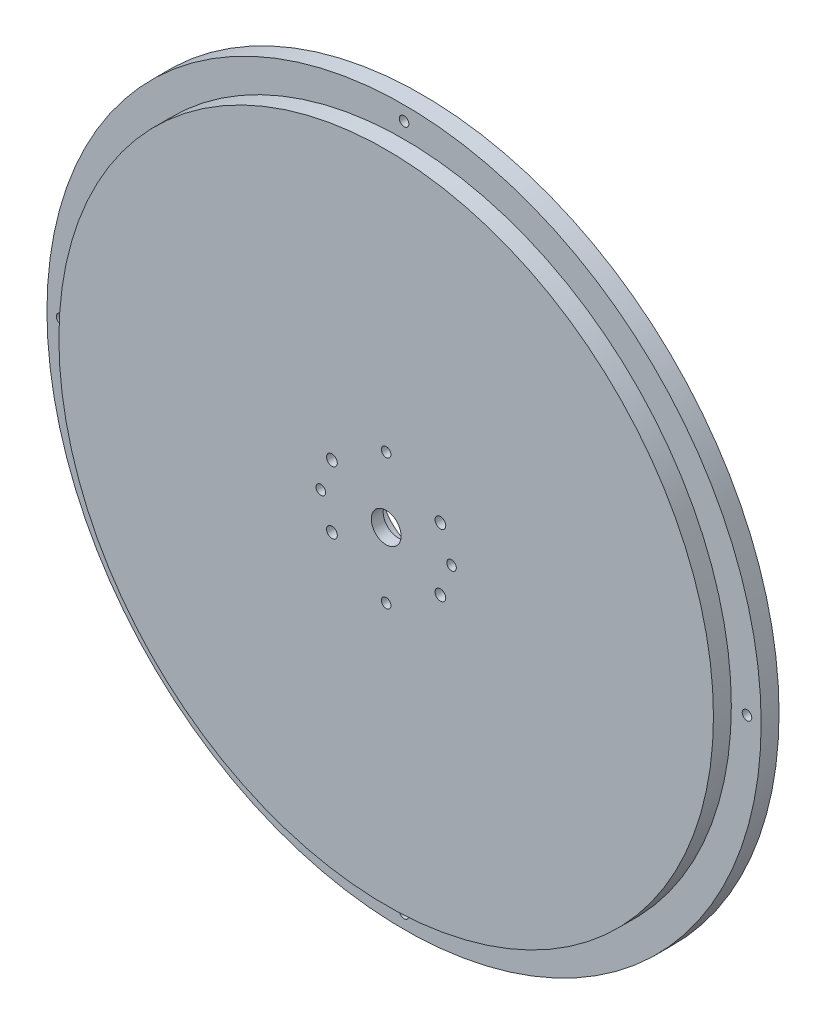
ISO-10303-21;
HEADER;
FILE_DESCRIPTION(('STEP AP214'),'2;1');
FILE_NAME('part.step','',(''),(''),'','','');
FILE_SCHEMA(('AUTOMOTIVE_DESIGN { 1 0 10303 214 1 1 1 1 }'));
ENDSEC;
DATA;
#1=APPLICATION_CONTEXT('core data for automotive mechanical design processes');
#2=APPLICATION_PROTOCOL_DEFINITION('international standard','automotive_design',2000,#1);
#3=PRODUCT_CONTEXT('',#1,'mechanical');
#4=PRODUCT('Part','Part','',(#3));
#5=PRODUCT_RELATED_PRODUCT_CATEGORY('part','',(#4));
#6=PRODUCT_DEFINITION_FORMATION('','',#4);
#7=PRODUCT_DEFINITION_CONTEXT('part definition',#1,'design');
#8=PRODUCT_DEFINITION('design','',#6,#7);
#9=PRODUCT_DEFINITION_SHAPE('','',#8);
#10=(LENGTH_UNIT() NAMED_UNIT(*) SI_UNIT(.MILLI.,.METRE.));
#11=(NAMED_UNIT(*) PLANE_ANGLE_UNIT() SI_UNIT($,.RADIAN.));
#12=(NAMED_UNIT(*) SI_UNIT($,.STERADIAN.) SOLID_ANGLE_UNIT());
#13=UNCERTAINTY_MEASURE_WITH_UNIT(LENGTH_MEASURE(1.E-05),#10,'distance_accuracy_value','');
#14=(GEOMETRIC_REPRESENTATION_CONTEXT(3) GLOBAL_UNCERTAINTY_ASSIGNED_CONTEXT((#13)) GLOBAL_UNIT_ASSIGNED_CONTEXT((#10,
#11,#12)) REPRESENTATION_CONTEXT('',''));
#15=CARTESIAN_POINT('',(0.,0.,0.));
#16=DIRECTION('',(0.,0.,1.));
#17=DIRECTION('',(1.,0.,0.));
#18=AXIS2_PLACEMENT_3D('',#15,#16,#17);
#19=CARTESIAN_POINT('',(0.,0.,20.));
#20=DIRECTION('',(0.,0.,-1.));
#21=DIRECTION('',(-1.,0.,0.));
#22=AXIS2_PLACEMENT_3D('',#19,#20,#21);
#23=CYLINDRICAL_SURFACE('',#22,5.);
#24=CARTESIAN_POINT('',(0.,0.,12.));
#25=DIRECTION('',(0.,0.,1.));
#26=DIRECTION('',(1.,0.,0.));
#27=AXIS2_PLACEMENT_3D('',#24,#25,#26);
#28=CIRCLE('',#27,5.);
#29=CARTESIAN_POINT('',(5.,0.,12.));
#30=VERTEX_POINT('',#29);
#31=EDGE_CURVE('E97',#30,#30,#28,.T.);
#32=ORIENTED_EDGE('',*,*,#31,.T.);
#33=EDGE_LOOP('',(#32));
#34=FACE_BOUND('',#33,.T.);
#35=CARTESIAN_POINT('',(0.,0.,8.));
#36=DIRECTION('',(0.,0.,-1.));
#37=DIRECTION('',(-1.,0.,0.));
#38=AXIS2_PLACEMENT_3D('',#35,#36,#37);
#39=CIRCLE('',#38,5.);
#40=CARTESIAN_POINT('',(-5.,0.,8.));
#41=VERTEX_POINT('',#40);
#42=EDGE_CURVE('E37',#41,#41,#39,.F.);
#43=ORIENTED_EDGE('',*,*,#42,.F.);
#44=EDGE_LOOP('',(#43));
#45=FACE_BOUND('',#44,.T.);
#46=ADVANCED_FACE('F33',(#34,#45),#23,.F.);
#47=CARTESIAN_POINT('',(0.,0.,12.));
#48=DIRECTION('',(0.,0.,-1.));
#49=DIRECTION('',(-1.,0.,0.));
#50=AXIS2_PLACEMENT_3D('',#47,#48,#49);
#51=CYLINDRICAL_SURFACE('',#50,109.75);
#52=CARTESIAN_POINT('',(0.,0.,6.));
#53=DIRECTION('',(0.,0.,1.));
#54=DIRECTION('',(1.,0.,0.));
#55=AXIS2_PLACEMENT_3D('',#52,#53,#54);
#56=CIRCLE('',#55,109.75);
#57=CARTESIAN_POINT('',(109.75,0.,6.));
#58=VERTEX_POINT('',#57);
#59=EDGE_CURVE('E41',#58,#58,#56,.T.);
#60=ORIENTED_EDGE('',*,*,#59,.T.);
#61=EDGE_LOOP('',(#60));
#62=FACE_BOUND('',#61,.T.);
#63=CARTESIAN_POINT('',(0.,0.,12.));
#64=DIRECTION('',(0.,0.,1.));
#65=DIRECTION('',(1.,0.,0.));
#66=AXIS2_PLACEMENT_3D('',#63,#64,#65);
#67=CIRCLE('',#66,109.75);
#68=CARTESIAN_POINT('',(109.75,0.,12.));
#69=VERTEX_POINT('',#68);
#70=EDGE_CURVE('E10',#69,#69,#67,.T.);
#71=ORIENTED_EDGE('',*,*,#70,.F.);
#72=EDGE_LOOP('',(#71));
#73=FACE_BOUND('',#72,.T.);
#74=ADVANCED_FACE('F35',(#62,#73),#51,.T.);
#75=CARTESIAN_POINT('',(0.,0.,12.));
#76=DIRECTION('',(0.,0.,1.));
#77=DIRECTION('',(1.,0.,0.));
#78=AXIS2_PLACEMENT_3D('',#75,#76,#77);
#79=PLANE('',#78);
#80=CARTESIAN_POINT('',(18.1865334794733,-10.4999999999998,12.));
#81=DIRECTION('',(0.,0.,1.));
#82=DIRECTION('',(1.,0.,0.));
#83=AXIS2_PLACEMENT_3D('',#80,#81,#82);
#84=CIRCLE('',#83,1.8);
#85=CARTESIAN_POINT('',(19.9865334794733,-10.4999999999998,12.));
#86=VERTEX_POINT('',#85);
#87=EDGE_CURVE('E104',#86,#86,#84,.T.);
#88=ORIENTED_EDGE('',*,*,#87,.F.);
#89=EDGE_LOOP('',(#88));
#90=FACE_BOUND('',#89,.T.);
#91=CARTESIAN_POINT('',(-18.1865334794732,-10.5000000000001,12.));
#92=DIRECTION('',(0.,0.,1.));
#93=DIRECTION('',(1.,0.,0.));
#94=AXIS2_PLACEMENT_3D('',#91,#92,#93);
#95=CIRCLE('',#94,1.8);
#96=CARTESIAN_POINT('',(-16.3865334794732,-10.5000000000001,12.));
#97=VERTEX_POINT('',#96);
#98=EDGE_CURVE('E107',#97,#97,#95,.T.);
#99=ORIENTED_EDGE('',*,*,#98,.F.);
#100=EDGE_LOOP('',(#99));
#101=FACE_BOUND('',#100,.T.);
#102=CARTESIAN_POINT('',(-18.1865334794732,10.5,12.));
#103=DIRECTION('',(0.,0.,1.));
#104=DIRECTION('',(1.,0.,0.));
#105=AXIS2_PLACEMENT_3D('',#102,#103,#104);
#106=CIRCLE('',#105,1.8);
#107=CARTESIAN_POINT('',(-16.3865334794732,10.5,12.));
#108=VERTEX_POINT('',#107);
#109=EDGE_CURVE('E110',#108,#108,#106,.T.);
#110=ORIENTED_EDGE('',*,*,#109,.F.);
#111=EDGE_LOOP('',(#110));
#112=FACE_BOUND('',#111,.T.);
#113=CARTESIAN_POINT('',(18.1865334794732,10.5,12.));
#114=DIRECTION('',(0.,0.,1.));
#115=DIRECTION('',(1.,0.,0.));
#116=AXIS2_PLACEMENT_3D('',#113,#114,#115);
#117=CIRCLE('',#116,1.8);
#118=CARTESIAN_POINT('',(19.9865334794732,10.5,12.));
#119=VERTEX_POINT('',#118);
#120=EDGE_CURVE('E113',#119,#119,#117,.T.);
#121=ORIENTED_EDGE('',*,*,#120,.F.);
#122=EDGE_LOOP('',(#121));
#123=FACE_BOUND('',#122,.T.);
#124=ORIENTED_EDGE('',*,*,#31,.F.);
#125=EDGE_LOOP('',(#124));
#126=FACE_BOUND('',#125,.T.);
#127=CARTESIAN_POINT('',(21.9203,0.,12.));
#128=DIRECTION('',(0.,0.,1.));
#129=DIRECTION('',(1.,0.,0.));
#130=AXIS2_PLACEMENT_3D('',#127,#128,#129);
#131=CIRCLE('',#130,1.6);
#132=CARTESIAN_POINT('',(23.5203,0.,12.));
#133=VERTEX_POINT('',#132);
#134=EDGE_CURVE('E83',#133,#133,#131,.T.);
#135=ORIENTED_EDGE('',*,*,#134,.F.);
#136=EDGE_LOOP('',(#135));
#137=FACE_BOUND('',#136,.T.);
#138=CARTESIAN_POINT('',(0.,21.9203000000002,12.));
#139=DIRECTION('',(0.,0.,1.));
#140=DIRECTION('',(1.,0.,0.));
#141=AXIS2_PLACEMENT_3D('',#138,#139,#140);
#142=CIRCLE('',#141,1.6000000000002);
#143=CARTESIAN_POINT('',(1.60000000000028,21.9203000000002,12.));
#144=VERTEX_POINT('',#143);
#145=EDGE_CURVE('E86',#144,#144,#142,.T.);
#146=ORIENTED_EDGE('',*,*,#145,.F.);
#147=EDGE_LOOP('',(#146));
#148=FACE_BOUND('',#147,.T.);
#149=CARTESIAN_POINT('',(-21.9203,-1.53068636783686E-13,12.));
#150=DIRECTION('',(0.,0.,1.));
#151=DIRECTION('',(1.,0.,0.));
#152=AXIS2_PLACEMENT_3D('',#149,#150,#151);
#153=CIRCLE('',#152,1.6);
#154=CARTESIAN_POINT('',(-20.3203,-1.53068636783686E-13,12.));
#155=VERTEX_POINT('',#154);
#156=EDGE_CURVE('E89',#155,#155,#153,.T.);
#157=ORIENTED_EDGE('',*,*,#156,.F.);
#158=EDGE_LOOP('',(#157));
#159=FACE_BOUND('',#158,.T.);
#160=CARTESIAN_POINT('',(5.15091550885208E-13,-21.9202999999998,12.));
#161=DIRECTION('',(0.,0.,1.));
#162=DIRECTION('',(1.,0.,0.));
#163=AXIS2_PLACEMENT_3D('',#160,#161,#162);
#164=CIRCLE('',#163,1.59999999999976);
#165=CARTESIAN_POINT('',(1.60000000000027,-21.9202999999998,12.));
#166=VERTEX_POINT('',#165);
#167=EDGE_CURVE('E70',#166,#166,#164,.T.);
#168=ORIENTED_EDGE('',*,*,#167,.F.);
#169=EDGE_LOOP('',(#168));
#170=FACE_BOUND('',#169,.T.);
#171=ORIENTED_EDGE('',*,*,#70,.T.);
#172=EDGE_LOOP('',(#171));
#173=FACE_BOUND('',#172,.T.);
#174=ADVANCED_FACE('F146',(#90,#101,#112,#123,#126,#137,#148,#159,#170,#173),#79,.T.);
#175=CARTESIAN_POINT('',(0.,0.,6.));
#176=DIRECTION('',(0.,0.,-1.));
#177=DIRECTION('',(-1.,0.,0.));
#178=AXIS2_PLACEMENT_3D('',#175,#176,#177);
#179=CYLINDRICAL_SURFACE('',#178,119.75);
#180=CARTESIAN_POINT('',(0.,0.,6.));
#181=DIRECTION('',(0.,0.,1.));
#182=DIRECTION('',(1.,0.,0.));
#183=AXIS2_PLACEMENT_3D('',#180,#181,#182);
#184=CIRCLE('',#183,119.75);
#185=CARTESIAN_POINT('',(119.75,0.,6.));
#186=VERTEX_POINT('',#185);
#187=EDGE_CURVE('E46',#186,#186,#184,.T.);
#188=ORIENTED_EDGE('',*,*,#187,.F.);
#189=EDGE_LOOP('',(#188));
#190=FACE_BOUND('',#189,.T.);
#191=CARTESIAN_POINT('',(0.,0.,0.));
#192=DIRECTION('',(0.,0.,1.));
#193=DIRECTION('',(1.,0.,0.));
#194=AXIS2_PLACEMENT_3D('',#191,#192,#193);
#195=CIRCLE('',#194,119.75);
#196=CARTESIAN_POINT('',(119.75,0.,0.));
#197=VERTEX_POINT('',#196);
#198=EDGE_CURVE('E48',#197,#197,#195,.T.);
#199=ORIENTED_EDGE('',*,*,#198,.T.);
#200=EDGE_LOOP('',(#199));
#201=FACE_BOUND('',#200,.T.);
#202=ADVANCED_FACE('F188',(#190,#201),#179,.T.);
#203=CARTESIAN_POINT('',(0.,0.,6.));
#204=DIRECTION('',(0.,0.,1.));
#205=DIRECTION('',(1.,0.,0.));
#206=AXIS2_PLACEMENT_3D('',#203,#204,#205);
#207=PLANE('',#206);
#208=CARTESIAN_POINT('',(-115.,0.,6.));
#209=DIRECTION('',(0.,0.,1.));
#210=DIRECTION('',(1.,0.,0.));
#211=AXIS2_PLACEMENT_3D('',#208,#209,#210);
#212=CIRCLE('',#211,1.60000000000001);
#213=CARTESIAN_POINT('',(-113.4,0.,6.));
#214=VERTEX_POINT('',#213);
#215=EDGE_CURVE('E51',#214,#214,#212,.F.);
#216=ORIENTED_EDGE('',*,*,#215,.T.);
#217=EDGE_LOOP('',(#216));
#218=FACE_BOUND('',#217,.T.);
#219=CARTESIAN_POINT('',(115.,0.,6.));
#220=DIRECTION('',(0.,0.,1.));
#221=DIRECTION('',(1.,0.,0.));
#222=AXIS2_PLACEMENT_3D('',#219,#220,#221);
#223=CIRCLE('',#222,1.60000000000001);
#224=CARTESIAN_POINT('',(116.6,0.,6.));
#225=VERTEX_POINT('',#224);
#226=EDGE_CURVE('E56',#225,#225,#223,.F.);
#227=ORIENTED_EDGE('',*,*,#226,.T.);
#228=EDGE_LOOP('',(#227));
#229=FACE_BOUND('',#228,.T.);
#230=CARTESIAN_POINT('',(0.,-115.,6.));
#231=DIRECTION('',(0.,0.,1.));
#232=DIRECTION('',(1.,0.,0.));
#233=AXIS2_PLACEMENT_3D('',#230,#231,#232);
#234=CIRCLE('',#233,1.6);
#235=CARTESIAN_POINT('',(1.6,-115.,6.));
#236=VERTEX_POINT('',#235);
#237=EDGE_CURVE('E59',#236,#236,#234,.F.);
#238=ORIENTED_EDGE('',*,*,#237,.T.);
#239=EDGE_LOOP('',(#238));
#240=FACE_BOUND('',#239,.T.);
#241=CARTESIAN_POINT('',(0.,115.,6.));
#242=DIRECTION('',(0.,0.,1.));
#243=DIRECTION('',(1.,0.,0.));
#244=AXIS2_PLACEMENT_3D('',#241,#242,#243);
#245=CIRCLE('',#244,1.6);
#246=CARTESIAN_POINT('',(1.6,115.,6.));
#247=VERTEX_POINT('',#246);
#248=EDGE_CURVE('E62',#247,#247,#245,.F.);
#249=ORIENTED_EDGE('',*,*,#248,.T.);
#250=EDGE_LOOP('',(#249));
#251=FACE_BOUND('',#250,.T.);
#252=ORIENTED_EDGE('',*,*,#59,.F.);
#253=EDGE_LOOP('',(#252));
#254=FACE_BOUND('',#253,.T.);
#255=ORIENTED_EDGE('',*,*,#187,.T.);
#256=EDGE_LOOP('',(#255));
#257=FACE_BOUND('',#256,.T.);
#258=ADVANCED_FACE('F185',(#218,#229,#240,#251,#254,#257),#207,.T.);
#259=CARTESIAN_POINT('',(0.,0.,0.));
#260=DIRECTION('',(0.,0.,1.));
#261=DIRECTION('',(1.,0.,0.));
#262=AXIS2_PLACEMENT_3D('',#259,#260,#261);
#263=PLANE('',#262);
#264=CARTESIAN_POINT('',(0.,0.,0.));
#265=DIRECTION('',(0.,0.,-1.));
#266=DIRECTION('',(-1.,0.,0.));
#267=AXIS2_PLACEMENT_3D('',#264,#265,#266);
#268=CIRCLE('',#267,14.);
#269=CARTESIAN_POINT('',(-14.,0.,0.));
#270=VERTEX_POINT('',#269);
#271=EDGE_CURVE('E128',#270,#270,#268,.T.);
#272=ORIENTED_EDGE('',*,*,#271,.F.);
#273=EDGE_LOOP('',(#272));
#274=FACE_BOUND('',#273,.T.);
#275=CARTESIAN_POINT('',(18.1865334794733,-10.4999999999998,0.));
#276=DIRECTION('',(0.,0.,-1.));
#277=DIRECTION('',(-1.,0.,0.));
#278=AXIS2_PLACEMENT_3D('',#275,#276,#277);
#279=CIRCLE('',#278,1.8);
#280=CARTESIAN_POINT('',(16.3865334794733,-10.4999999999998,0.));
#281=VERTEX_POINT('',#280);
#282=EDGE_CURVE('E120',#281,#281,#279,.T.);
#283=ORIENTED_EDGE('',*,*,#282,.F.);
#284=EDGE_LOOP('',(#283));
#285=FACE_BOUND('',#284,.T.);
#286=CARTESIAN_POINT('',(-18.1865334794732,-10.5000000000001,0.));
#287=DIRECTION('',(0.,0.,-1.));
#288=DIRECTION('',(-1.,0.,0.));
#289=AXIS2_PLACEMENT_3D('',#286,#287,#288);
#290=CIRCLE('',#289,1.8);
#291=CARTESIAN_POINT('',(-19.9865334794732,-10.5000000000001,0.));
#292=VERTEX_POINT('',#291);
#293=EDGE_CURVE('E123',#292,#292,#290,.T.);
#294=ORIENTED_EDGE('',*,*,#293,.F.);
#295=EDGE_LOOP('',(#294));
#296=FACE_BOUND('',#295,.T.);
#297=CARTESIAN_POINT('',(-18.1865334794732,10.5,0.));
#298=DIRECTION('',(0.,0.,-1.));
#299=DIRECTION('',(-1.,0.,0.));
#300=AXIS2_PLACEMENT_3D('',#297,#298,#299);
#301=CIRCLE('',#300,1.8);
#302=CARTESIAN_POINT('',(-19.9865334794732,10.5,0.));
#303=VERTEX_POINT('',#302);
#304=EDGE_CURVE('E119',#303,#303,#301,.T.);
#305=ORIENTED_EDGE('',*,*,#304,.F.);
#306=EDGE_LOOP('',(#305));
#307=FACE_BOUND('',#306,.T.);
#308=CARTESIAN_POINT('',(18.1865334794732,10.5,0.));
#309=DIRECTION('',(0.,0.,-1.));
#310=DIRECTION('',(-1.,0.,0.));
#311=AXIS2_PLACEMENT_3D('',#308,#309,#310);
#312=CIRCLE('',#311,1.8);
#313=CARTESIAN_POINT('',(16.3865334794732,10.5,0.));
#314=VERTEX_POINT('',#313);
#315=EDGE_CURVE('E116',#314,#314,#312,.T.);
#316=ORIENTED_EDGE('',*,*,#315,.F.);
#317=EDGE_LOOP('',(#316));
#318=FACE_BOUND('',#317,.T.);
#319=CARTESIAN_POINT('',(21.9203,0.,0.));
#320=DIRECTION('',(0.,0.,-1.));
#321=DIRECTION('',(-1.,0.,0.));
#322=AXIS2_PLACEMENT_3D('',#319,#320,#321);
#323=CIRCLE('',#322,1.6);
#324=CARTESIAN_POINT('',(20.3203,0.,0.));
#325=VERTEX_POINT('',#324);
#326=EDGE_CURVE('E92',#325,#325,#323,.T.);
#327=ORIENTED_EDGE('',*,*,#326,.F.);
#328=EDGE_LOOP('',(#327));
#329=FACE_BOUND('',#328,.T.);
#330=CARTESIAN_POINT('',(0.,21.9203000000002,0.));
#331=DIRECTION('',(0.,0.,-1.));
#332=DIRECTION('',(-1.,0.,0.));
#333=AXIS2_PLACEMENT_3D('',#330,#331,#332);
#334=CIRCLE('',#333,1.6000000000002);
#335=CARTESIAN_POINT('',(-1.60000000000012,21.9203000000002,0.));
#336=VERTEX_POINT('',#335);
#337=EDGE_CURVE('E96',#336,#336,#334,.T.);
#338=ORIENTED_EDGE('',*,*,#337,.F.);
#339=EDGE_LOOP('',(#338));
#340=FACE_BOUND('',#339,.T.);
#341=CARTESIAN_POINT('',(-21.9203,-1.53068636783686E-13,0.));
#342=DIRECTION('',(0.,0.,-1.));
#343=DIRECTION('',(-1.,0.,0.));
#344=AXIS2_PLACEMENT_3D('',#341,#342,#343);
#345=CIRCLE('',#344,1.6);
#346=CARTESIAN_POINT('',(-23.5203,-1.53068636783686E-13,0.));
#347=VERTEX_POINT('',#346);
#348=EDGE_CURVE('E93',#347,#347,#345,.T.);
#349=ORIENTED_EDGE('',*,*,#348,.F.);
#350=EDGE_LOOP('',(#349));
#351=FACE_BOUND('',#350,.T.);
#352=CARTESIAN_POINT('',(5.15091550885208E-13,-21.9202999999998,0.));
#353=DIRECTION('',(0.,0.,-1.));
#354=DIRECTION('',(-1.,0.,0.));
#355=AXIS2_PLACEMENT_3D('',#352,#353,#354);
#356=CIRCLE('',#355,1.59999999999976);
#357=CARTESIAN_POINT('',(-1.59999999999924,-21.9202999999998,0.));
#358=VERTEX_POINT('',#357);
#359=EDGE_CURVE('E80',#358,#358,#356,.T.);
#360=ORIENTED_EDGE('',*,*,#359,.F.);
#361=EDGE_LOOP('',(#360));
#362=FACE_BOUND('',#361,.T.);
#363=CARTESIAN_POINT('',(-115.,0.,0.));
#364=DIRECTION('',(0.,0.,1.));
#365=DIRECTION('',(1.,0.,0.));
#366=AXIS2_PLACEMENT_3D('',#363,#364,#365);
#367=CIRCLE('',#366,1.60000000000001);
#368=CARTESIAN_POINT('',(-113.4,0.,0.));
#369=VERTEX_POINT('',#368);
#370=EDGE_CURVE('E65',#369,#369,#367,.T.);
#371=ORIENTED_EDGE('',*,*,#370,.T.);
#372=EDGE_LOOP('',(#371));
#373=FACE_BOUND('',#372,.T.);
#374=CARTESIAN_POINT('',(115.,0.,0.));
#375=DIRECTION('',(0.,0.,1.));
#376=DIRECTION('',(1.,0.,0.));
#377=AXIS2_PLACEMENT_3D('',#374,#375,#376);
#378=CIRCLE('',#377,1.60000000000001);
#379=CARTESIAN_POINT('',(116.6,0.,0.));
#380=VERTEX_POINT('',#379);
#381=EDGE_CURVE('E73',#380,#380,#378,.T.);
#382=ORIENTED_EDGE('',*,*,#381,.T.);
#383=EDGE_LOOP('',(#382));
#384=FACE_BOUND('',#383,.T.);
#385=CARTESIAN_POINT('',(0.,-115.,0.));
#386=DIRECTION('',(0.,0.,1.));
#387=DIRECTION('',(1.,0.,0.));
#388=AXIS2_PLACEMENT_3D('',#385,#386,#387);
#389=CIRCLE('',#388,1.6);
#390=CARTESIAN_POINT('',(1.6,-115.,0.));
#391=VERTEX_POINT('',#390);
#392=EDGE_CURVE('E69',#391,#391,#389,.T.);
#393=ORIENTED_EDGE('',*,*,#392,.T.);
#394=EDGE_LOOP('',(#393));
#395=FACE_BOUND('',#394,.T.);
#396=CARTESIAN_POINT('',(0.,115.,0.));
#397=DIRECTION('',(0.,0.,1.));
#398=DIRECTION('',(1.,0.,0.));
#399=AXIS2_PLACEMENT_3D('',#396,#397,#398);
#400=CIRCLE('',#399,1.6);
#401=CARTESIAN_POINT('',(1.6,115.,0.));
#402=VERTEX_POINT('',#401);
#403=EDGE_CURVE('E66',#402,#402,#400,.T.);
#404=ORIENTED_EDGE('',*,*,#403,.T.);
#405=EDGE_LOOP('',(#404));
#406=FACE_BOUND('',#405,.T.);
#407=ORIENTED_EDGE('',*,*,#198,.F.);
#408=EDGE_LOOP('',(#407));
#409=FACE_BOUND('',#408,.T.);
#410=ADVANCED_FACE('F183',(#274,#285,#296,#307,#318,#329,#340,#351,#362,#373,#384,#395,#406,
#409),#263,.F.);
#411=CARTESIAN_POINT('',(0.,115.,10.));
#412=DIRECTION('',(0.,0.,-1.));
#413=DIRECTION('',(-1.,0.,0.));
#414=AXIS2_PLACEMENT_3D('',#411,#412,#413);
#415=CYLINDRICAL_SURFACE('',#414,1.6);
#416=ORIENTED_EDGE('',*,*,#248,.F.);
#417=EDGE_LOOP('',(#416));
#418=FACE_BOUND('',#417,.T.);
#419=ORIENTED_EDGE('',*,*,#403,.F.);
#420=EDGE_LOOP('',(#419));
#421=FACE_BOUND('',#420,.T.);
#422=ADVANCED_FACE('F179',(#418,#421),#415,.F.);
#423=CARTESIAN_POINT('',(0.,-115.,10.));
#424=DIRECTION('',(0.,0.,-1.));
#425=DIRECTION('',(-1.,0.,0.));
#426=AXIS2_PLACEMENT_3D('',#423,#424,#425);
#427=CYLINDRICAL_SURFACE('',#426,1.6);
#428=ORIENTED_EDGE('',*,*,#237,.F.);
#429=EDGE_LOOP('',(#428));
#430=FACE_BOUND('',#429,.T.);
#431=ORIENTED_EDGE('',*,*,#392,.F.);
#432=EDGE_LOOP('',(#431));
#433=FACE_BOUND('',#432,.T.);
#434=ADVANCED_FACE('F175',(#430,#433),#427,.F.);
#435=CARTESIAN_POINT('',(115.,0.,10.));
#436=DIRECTION('',(0.,0.,-1.));
#437=DIRECTION('',(-1.,0.,0.));
#438=AXIS2_PLACEMENT_3D('',#435,#436,#437);
#439=CYLINDRICAL_SURFACE('',#438,1.60000000000001);
#440=ORIENTED_EDGE('',*,*,#226,.F.);
#441=EDGE_LOOP('',(#440));
#442=FACE_BOUND('',#441,.T.);
#443=ORIENTED_EDGE('',*,*,#381,.F.);
#444=EDGE_LOOP('',(#443));
#445=FACE_BOUND('',#444,.T.);
#446=ADVANCED_FACE('F171',(#442,#445),#439,.F.);
#447=CARTESIAN_POINT('',(-115.,0.,10.));
#448=DIRECTION('',(0.,0.,-1.));
#449=DIRECTION('',(-1.,0.,0.));
#450=AXIS2_PLACEMENT_3D('',#447,#448,#449);
#451=CYLINDRICAL_SURFACE('',#450,1.60000000000001);
#452=ORIENTED_EDGE('',*,*,#215,.F.);
#453=EDGE_LOOP('',(#452));
#454=FACE_BOUND('',#453,.T.);
#455=ORIENTED_EDGE('',*,*,#370,.F.);
#456=EDGE_LOOP('',(#455));
#457=FACE_BOUND('',#456,.T.);
#458=ADVANCED_FACE('F167',(#454,#457),#451,.F.);
#459=CARTESIAN_POINT('',(5.15091550885208E-13,-21.9202999999998,20.));
#460=DIRECTION('',(0.,0.,-1.));
#461=DIRECTION('',(-1.,0.,0.));
#462=AXIS2_PLACEMENT_3D('',#459,#460,#461);
#463=CYLINDRICAL_SURFACE('',#462,1.59999999999976);
#464=ORIENTED_EDGE('',*,*,#167,.T.);
#465=EDGE_LOOP('',(#464));
#466=FACE_BOUND('',#465,.T.);
#467=ORIENTED_EDGE('',*,*,#359,.T.);
#468=EDGE_LOOP('',(#467));
#469=FACE_BOUND('',#468,.T.);
#470=ADVANCED_FACE('F163',(#466,#469),#463,.F.);
#471=CARTESIAN_POINT('',(-21.9203,-1.53068636783686E-13,20.));
#472=DIRECTION('',(0.,0.,-1.));
#473=DIRECTION('',(-1.,0.,0.));
#474=AXIS2_PLACEMENT_3D('',#471,#472,#473);
#475=CYLINDRICAL_SURFACE('',#474,1.6);
#476=ORIENTED_EDGE('',*,*,#156,.T.);
#477=EDGE_LOOP('',(#476));
#478=FACE_BOUND('',#477,.T.);
#479=ORIENTED_EDGE('',*,*,#348,.T.);
#480=EDGE_LOOP('',(#479));
#481=FACE_BOUND('',#480,.T.);
#482=ADVANCED_FACE('F159',(#478,#481),#475,.F.);
#483=CARTESIAN_POINT('',(0.,21.9203000000002,20.));
#484=DIRECTION('',(0.,0.,-1.));
#485=DIRECTION('',(-1.,0.,0.));
#486=AXIS2_PLACEMENT_3D('',#483,#484,#485);
#487=CYLINDRICAL_SURFACE('',#486,1.6000000000002);
#488=ORIENTED_EDGE('',*,*,#145,.T.);
#489=EDGE_LOOP('',(#488));
#490=FACE_BOUND('',#489,.T.);
#491=ORIENTED_EDGE('',*,*,#337,.T.);
#492=EDGE_LOOP('',(#491));
#493=FACE_BOUND('',#492,.T.);
#494=ADVANCED_FACE('F155',(#490,#493),#487,.F.);
#495=CARTESIAN_POINT('',(21.9203,0.,20.));
#496=DIRECTION('',(0.,0.,-1.));
#497=DIRECTION('',(-1.,0.,0.));
#498=AXIS2_PLACEMENT_3D('',#495,#496,#497);
#499=CYLINDRICAL_SURFACE('',#498,1.6);
#500=ORIENTED_EDGE('',*,*,#134,.T.);
#501=EDGE_LOOP('',(#500));
#502=FACE_BOUND('',#501,.T.);
#503=ORIENTED_EDGE('',*,*,#326,.T.);
#504=EDGE_LOOP('',(#503));
#505=FACE_BOUND('',#504,.T.);
#506=ADVANCED_FACE('F152',(#502,#505),#499,.F.);
#507=CARTESIAN_POINT('',(18.1865334794732,10.5,30.));
#508=DIRECTION('',(0.,0.,-1.));
#509=DIRECTION('',(-1.,0.,0.));
#510=AXIS2_PLACEMENT_3D('',#507,#508,#509);
#511=CYLINDRICAL_SURFACE('',#510,1.8);
#512=ORIENTED_EDGE('',*,*,#120,.T.);
#513=EDGE_LOOP('',(#512));
#514=FACE_BOUND('',#513,.T.);
#515=ORIENTED_EDGE('',*,*,#315,.T.);
#516=EDGE_LOOP('',(#515));
#517=FACE_BOUND('',#516,.T.);
#518=ADVANCED_FACE('F150',(#514,#517),#511,.F.);
#519=CARTESIAN_POINT('',(-18.1865334794732,10.5,30.));
#520=DIRECTION('',(0.,0.,-1.));
#521=DIRECTION('',(-1.,0.,0.));
#522=AXIS2_PLACEMENT_3D('',#519,#520,#521);
#523=CYLINDRICAL_SURFACE('',#522,1.8);
#524=ORIENTED_EDGE('',*,*,#109,.T.);
#525=EDGE_LOOP('',(#524));
#526=FACE_BOUND('',#525,.T.);
#527=ORIENTED_EDGE('',*,*,#304,.T.);
#528=EDGE_LOOP('',(#527));
#529=FACE_BOUND('',#528,.T.);
#530=ADVANCED_FACE('F237',(#526,#529),#523,.F.);
#531=CARTESIAN_POINT('',(-18.1865334794732,-10.5000000000001,30.));
#532=DIRECTION('',(0.,0.,-1.));
#533=DIRECTION('',(-1.,0.,0.));
#534=AXIS2_PLACEMENT_3D('',#531,#532,#533);
#535=CYLINDRICAL_SURFACE('',#534,1.8);
#536=ORIENTED_EDGE('',*,*,#98,.T.);
#537=EDGE_LOOP('',(#536));
#538=FACE_BOUND('',#537,.T.);
#539=ORIENTED_EDGE('',*,*,#293,.T.);
#540=EDGE_LOOP('',(#539));
#541=FACE_BOUND('',#540,.T.);
#542=ADVANCED_FACE('F242',(#538,#541),#535,.F.);
#543=CARTESIAN_POINT('',(18.1865334794733,-10.4999999999998,30.));
#544=DIRECTION('',(0.,0.,-1.));
#545=DIRECTION('',(-1.,0.,0.));
#546=AXIS2_PLACEMENT_3D('',#543,#544,#545);
#547=CYLINDRICAL_SURFACE('',#546,1.8);
#548=ORIENTED_EDGE('',*,*,#87,.T.);
#549=EDGE_LOOP('',(#548));
#550=FACE_BOUND('',#549,.T.);
#551=ORIENTED_EDGE('',*,*,#282,.T.);
#552=EDGE_LOOP('',(#551));
#553=FACE_BOUND('',#552,.T.);
#554=ADVANCED_FACE('F260',(#550,#553),#547,.F.);
#555=CARTESIAN_POINT('',(0.,0.,8.));
#556=DIRECTION('',(0.,0.,-1.));
#557=DIRECTION('',(-1.,0.,0.));
#558=AXIS2_PLACEMENT_3D('',#555,#556,#557);
#559=PLANE('',#558);
#560=CARTESIAN_POINT('',(0.,0.,8.));
#561=DIRECTION('',(0.,0.,-1.));
#562=DIRECTION('',(-1.,0.,0.));
#563=AXIS2_PLACEMENT_3D('',#560,#561,#562);
#564=CIRCLE('',#563,14.);
#565=CARTESIAN_POINT('',(-14.,0.,8.));
#566=VERTEX_POINT('',#565);
#567=EDGE_CURVE('E131',#566,#566,#564,.T.);
#568=ORIENTED_EDGE('',*,*,#567,.T.);
#569=EDGE_LOOP('',(#568));
#570=FACE_BOUND('',#569,.T.);
#571=ORIENTED_EDGE('',*,*,#42,.T.);
#572=EDGE_LOOP('',(#571));
#573=FACE_BOUND('',#572,.T.);
#574=ADVANCED_FACE('F138',(#570,#573),#559,.T.);
#575=CARTESIAN_POINT('',(0.,0.,8.));
#576=DIRECTION('',(0.,0.,-1.));
#577=DIRECTION('',(-1.,0.,0.));
#578=AXIS2_PLACEMENT_3D('',#575,#576,#577);
#579=CYLINDRICAL_SURFACE('',#578,14.);
#580=ORIENTED_EDGE('',*,*,#567,.F.);
#581=EDGE_LOOP('',(#580));
#582=FACE_BOUND('',#581,.T.);
#583=ORIENTED_EDGE('',*,*,#271,.T.);
#584=EDGE_LOOP('',(#583));
#585=FACE_BOUND('',#584,.T.);
#586=ADVANCED_FACE('F265',(#582,#585),#579,.F.);
#587=CLOSED_SHELL('',(#46,#74,#174,#202,#258,#410,#422,#434,#446,#458,#470,#482,#494,#506,#518,
#530,#542,#554,#574,#586));
#588=MANIFOLD_SOLID_BREP('B2',#587);
#589=ADVANCED_BREP_SHAPE_REPRESENTATION('',(#18,#588),#14);
#590=SHAPE_DEFINITION_REPRESENTATION(#9,#589);
ENDSEC;
END-ISO-10303-21;
